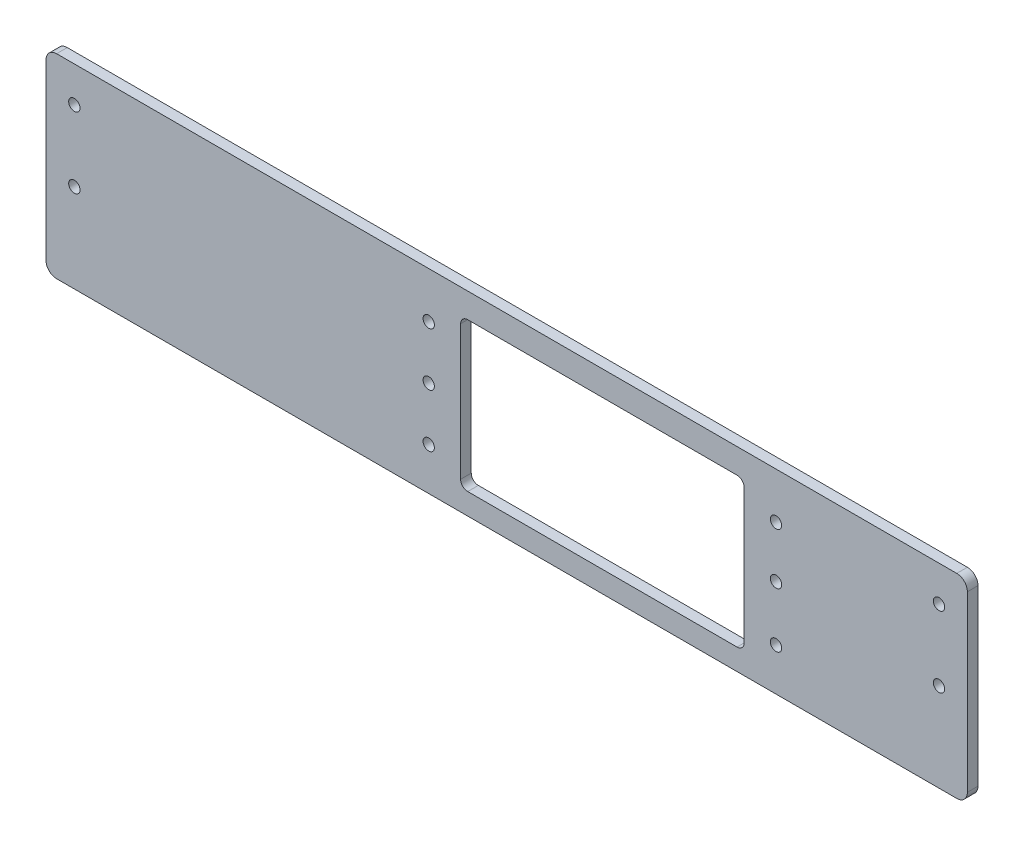
ISO-10303-21;
HEADER;
FILE_DESCRIPTION(('STEP AP214'),'2;1');
FILE_NAME('part.step','',(''),(''),'','','');
FILE_SCHEMA(('AUTOMOTIVE_DESIGN { 1 0 10303 214 1 1 1 1 }'));
ENDSEC;
DATA;
#1=APPLICATION_CONTEXT('core data for automotive mechanical design processes');
#2=APPLICATION_PROTOCOL_DEFINITION('international standard','automotive_design',2000,#1);
#3=PRODUCT_CONTEXT('',#1,'mechanical');
#4=PRODUCT('Part','Part','',(#3));
#5=PRODUCT_RELATED_PRODUCT_CATEGORY('part','',(#4));
#6=PRODUCT_DEFINITION_FORMATION('','',#4);
#7=PRODUCT_DEFINITION_CONTEXT('part definition',#1,'design');
#8=PRODUCT_DEFINITION('design','',#6,#7);
#9=PRODUCT_DEFINITION_SHAPE('','',#8);
#10=(LENGTH_UNIT() NAMED_UNIT(*) SI_UNIT(.MILLI.,.METRE.));
#11=(NAMED_UNIT(*) PLANE_ANGLE_UNIT() SI_UNIT($,.RADIAN.));
#12=(NAMED_UNIT(*) SI_UNIT($,.STERADIAN.) SOLID_ANGLE_UNIT());
#13=UNCERTAINTY_MEASURE_WITH_UNIT(LENGTH_MEASURE(1.E-05),#10,'distance_accuracy_value','');
#14=(GEOMETRIC_REPRESENTATION_CONTEXT(3) GLOBAL_UNCERTAINTY_ASSIGNED_CONTEXT((#13)) GLOBAL_UNIT_ASSIGNED_CONTEXT((#10,
#11,#12)) REPRESENTATION_CONTEXT('',''));
#15=CARTESIAN_POINT('',(0.,0.,0.));
#16=DIRECTION('',(0.,0.,1.));
#17=DIRECTION('',(1.,0.,0.));
#18=AXIS2_PLACEMENT_3D('',#15,#16,#17);
#19=CARTESIAN_POINT('',(-130.,-27.5,3.));
#20=DIRECTION('',(1.,0.,0.));
#21=DIRECTION('',(0.,0.,-1.));
#22=AXIS2_PLACEMENT_3D('',#19,#20,#21);
#23=PLANE('',#22);
#24=DIRECTION('',(0.,-1.,0.));
#25=VECTOR('',#24,1.);
#26=CARTESIAN_POINT('',(-130.,-27.5,0.));
#27=LINE('',#26,#25);
#28=CARTESIAN_POINT('',(-130.,24.5,0.));
#29=VERTEX_POINT('',#28);
#30=CARTESIAN_POINT('',(-130.,-24.5,0.));
#31=VERTEX_POINT('',#30);
#32=EDGE_CURVE('E227',#29,#31,#27,.T.);
#33=ORIENTED_EDGE('',*,*,#32,.T.);
#34=DIRECTION('',(0.,0.,-1.));
#35=VECTOR('',#34,1.);
#36=CARTESIAN_POINT('',(-130.,-24.5,3.));
#37=LINE('',#36,#35);
#38=CARTESIAN_POINT('',(-130.,-24.5,3.));
#39=VERTEX_POINT('',#38);
#40=EDGE_CURVE('E211',#31,#39,#37,.F.);
#41=ORIENTED_EDGE('',*,*,#40,.T.);
#42=DIRECTION('',(0.,-1.,0.));
#43=VECTOR('',#42,1.);
#44=CARTESIAN_POINT('',(-130.,-27.5,3.));
#45=LINE('',#44,#43);
#46=CARTESIAN_POINT('',(-130.,24.5,3.));
#47=VERTEX_POINT('',#46);
#48=EDGE_CURVE('E177',#47,#39,#45,.T.);
#49=ORIENTED_EDGE('',*,*,#48,.F.);
#50=DIRECTION('',(0.,0.,-1.));
#51=VECTOR('',#50,1.);
#52=CARTESIAN_POINT('',(-130.,24.5,3.));
#53=LINE('',#52,#51);
#54=EDGE_CURVE('E208',#47,#29,#53,.T.);
#55=ORIENTED_EDGE('',*,*,#54,.T.);
#56=EDGE_LOOP('',(#33,#41,#49,#55));
#57=FACE_BOUND('',#56,.T.);
#58=ADVANCED_FACE('F38',(#57),#23,.F.);
#59=CARTESIAN_POINT('',(130.,-27.5,3.));
#60=DIRECTION('',(0.,1.,0.));
#61=DIRECTION('',(-1.,0.,0.));
#62=AXIS2_PLACEMENT_3D('',#59,#60,#61);
#63=PLANE('',#62);
#64=DIRECTION('',(1.,0.,0.));
#65=VECTOR('',#64,1.);
#66=CARTESIAN_POINT('',(130.,-27.5,0.));
#67=LINE('',#66,#65);
#68=CARTESIAN_POINT('',(-127.,-27.5,0.));
#69=VERTEX_POINT('',#68);
#70=CARTESIAN_POINT('',(127.,-27.5,0.));
#71=VERTEX_POINT('',#70);
#72=EDGE_CURVE('E183',#69,#71,#67,.T.);
#73=ORIENTED_EDGE('',*,*,#72,.T.);
#74=DIRECTION('',(0.,0.,-1.));
#75=VECTOR('',#74,1.);
#76=CARTESIAN_POINT('',(127.,-27.5,3.));
#77=LINE('',#76,#75);
#78=CARTESIAN_POINT('',(127.,-27.5,3.));
#79=VERTEX_POINT('',#78);
#80=EDGE_CURVE('E206',#71,#79,#77,.F.);
#81=ORIENTED_EDGE('',*,*,#80,.T.);
#82=DIRECTION('',(1.,0.,0.));
#83=VECTOR('',#82,1.);
#84=CARTESIAN_POINT('',(130.,-27.5,3.));
#85=LINE('',#84,#83);
#86=CARTESIAN_POINT('',(-127.,-27.5,3.));
#87=VERTEX_POINT('',#86);
#88=EDGE_CURVE('E181',#87,#79,#85,.T.);
#89=ORIENTED_EDGE('',*,*,#88,.F.);
#90=DIRECTION('',(0.,0.,-1.));
#91=VECTOR('',#90,1.);
#92=CARTESIAN_POINT('',(-127.,-27.5,3.));
#93=LINE('',#92,#91);
#94=EDGE_CURVE('E203',#87,#69,#93,.T.);
#95=ORIENTED_EDGE('',*,*,#94,.T.);
#96=EDGE_LOOP('',(#73,#81,#89,#95));
#97=FACE_BOUND('',#96,.T.);
#98=ADVANCED_FACE('F345',(#97),#63,.F.);
#99=CARTESIAN_POINT('',(130.,-27.5,3.));
#100=DIRECTION('',(-1.,0.,0.));
#101=DIRECTION('',(0.,0.,1.));
#102=AXIS2_PLACEMENT_3D('',#99,#100,#101);
#103=PLANE('',#102);
#104=DIRECTION('',(0.,1.,0.));
#105=VECTOR('',#104,1.);
#106=CARTESIAN_POINT('',(130.,-27.5,0.));
#107=LINE('',#106,#105);
#108=CARTESIAN_POINT('',(130.,-24.5,0.));
#109=VERTEX_POINT('',#108);
#110=CARTESIAN_POINT('',(130.,24.5,0.));
#111=VERTEX_POINT('',#110);
#112=EDGE_CURVE('E178',#109,#111,#107,.T.);
#113=ORIENTED_EDGE('',*,*,#112,.T.);
#114=DIRECTION('',(0.,0.,-1.));
#115=VECTOR('',#114,1.);
#116=CARTESIAN_POINT('',(130.,24.5,3.));
#117=LINE('',#116,#115);
#118=CARTESIAN_POINT('',(130.,24.5,3.));
#119=VERTEX_POINT('',#118);
#120=EDGE_CURVE('E156',#111,#119,#117,.F.);
#121=ORIENTED_EDGE('',*,*,#120,.T.);
#122=DIRECTION('',(0.,1.,0.));
#123=VECTOR('',#122,1.);
#124=CARTESIAN_POINT('',(130.,-27.5,3.));
#125=LINE('',#124,#123);
#126=CARTESIAN_POINT('',(130.,-24.5,3.));
#127=VERTEX_POINT('',#126);
#128=EDGE_CURVE('E336',#127,#119,#125,.T.);
#129=ORIENTED_EDGE('',*,*,#128,.F.);
#130=DIRECTION('',(0.,0.,-1.));
#131=VECTOR('',#130,1.);
#132=CARTESIAN_POINT('',(130.,-24.5,3.));
#133=LINE('',#132,#131);
#134=EDGE_CURVE('E161',#127,#109,#133,.T.);
#135=ORIENTED_EDGE('',*,*,#134,.T.);
#136=EDGE_LOOP('',(#113,#121,#129,#135));
#137=FACE_BOUND('',#136,.T.);
#138=ADVANCED_FACE('F355',(#137),#103,.F.);
#139=CARTESIAN_POINT('',(130.,27.5,3.));
#140=DIRECTION('',(0.,-1.,0.));
#141=DIRECTION('',(1.,0.,0.));
#142=AXIS2_PLACEMENT_3D('',#139,#140,#141);
#143=PLANE('',#142);
#144=DIRECTION('',(-1.,0.,0.));
#145=VECTOR('',#144,1.);
#146=CARTESIAN_POINT('',(130.,27.5,3.));
#147=LINE('',#146,#145);
#148=CARTESIAN_POINT('',(127.,27.5,3.));
#149=VERTEX_POINT('',#148);
#150=CARTESIAN_POINT('',(-127.,27.5,3.));
#151=VERTEX_POINT('',#150);
#152=EDGE_CURVE('E171',#149,#151,#147,.T.);
#153=ORIENTED_EDGE('',*,*,#152,.F.);
#154=DIRECTION('',(0.,0.,-1.));
#155=VECTOR('',#154,1.);
#156=CARTESIAN_POINT('',(127.,27.5,3.));
#157=LINE('',#156,#155);
#158=CARTESIAN_POINT('',(127.,27.5,0.));
#159=VERTEX_POINT('',#158);
#160=EDGE_CURVE('E155',#149,#159,#157,.T.);
#161=ORIENTED_EDGE('',*,*,#160,.T.);
#162=DIRECTION('',(-1.,0.,0.));
#163=VECTOR('',#162,1.);
#164=CARTESIAN_POINT('',(130.,27.5,0.));
#165=LINE('',#164,#163);
#166=CARTESIAN_POINT('',(-127.,27.5,0.));
#167=VERTEX_POINT('',#166);
#168=EDGE_CURVE('E168',#159,#167,#165,.T.);
#169=ORIENTED_EDGE('',*,*,#168,.T.);
#170=DIRECTION('',(0.,0.,-1.));
#171=VECTOR('',#170,1.);
#172=CARTESIAN_POINT('',(-127.,27.5,3.));
#173=LINE('',#172,#171);
#174=EDGE_CURVE('E173',#167,#151,#173,.F.);
#175=ORIENTED_EDGE('',*,*,#174,.T.);
#176=EDGE_LOOP('',(#153,#161,#169,#175));
#177=FACE_BOUND('',#176,.T.);
#178=ADVANCED_FACE('F167',(#177),#143,.F.);
#179=CARTESIAN_POINT('',(0.,0.,3.));
#180=DIRECTION('',(0.,0.,1.));
#181=DIRECTION('',(1.,0.,0.));
#182=AXIS2_PLACEMENT_3D('',#179,#180,#181);
#183=PLANE('',#182);
#184=CARTESIAN_POINT('',(75.9999999999999,14.5,3.));
#185=DIRECTION('',(0.,0.,1.));
#186=DIRECTION('',(1.,0.,0.));
#187=AXIS2_PLACEMENT_3D('',#184,#185,#186);
#188=CIRCLE('',#187,1.6);
#189=CARTESIAN_POINT('',(77.5999999999999,14.5,3.));
#190=VERTEX_POINT('',#189);
#191=EDGE_CURVE('E639',#190,#190,#188,.T.);
#192=ORIENTED_EDGE('',*,*,#191,.F.);
#193=EDGE_LOOP('',(#192));
#194=FACE_BOUND('',#193,.T.);
#195=CARTESIAN_POINT('',(-22.0000000000001,-15.5,3.));
#196=DIRECTION('',(0.,0.,1.));
#197=DIRECTION('',(1.,0.,0.));
#198=AXIS2_PLACEMENT_3D('',#195,#196,#197);
#199=CIRCLE('',#198,1.6);
#200=CARTESIAN_POINT('',(-20.4000000000001,-15.5,3.));
#201=VERTEX_POINT('',#200);
#202=EDGE_CURVE('E642',#201,#201,#199,.T.);
#203=ORIENTED_EDGE('',*,*,#202,.F.);
#204=EDGE_LOOP('',(#203));
#205=FACE_BOUND('',#204,.T.);
#206=CARTESIAN_POINT('',(-22.0000000000001,-0.499999999999995,3.));
#207=DIRECTION('',(0.,0.,1.));
#208=DIRECTION('',(1.,0.,0.));
#209=AXIS2_PLACEMENT_3D('',#206,#207,#208);
#210=CIRCLE('',#209,1.6);
#211=CARTESIAN_POINT('',(-20.4000000000001,-0.499999999999995,3.));
#212=VERTEX_POINT('',#211);
#213=EDGE_CURVE('E645',#212,#212,#210,.T.);
#214=ORIENTED_EDGE('',*,*,#213,.F.);
#215=EDGE_LOOP('',(#214));
#216=FACE_BOUND('',#215,.T.);
#217=CARTESIAN_POINT('',(-22.0000000000001,14.5,3.));
#218=DIRECTION('',(0.,0.,1.));
#219=DIRECTION('',(1.,0.,0.));
#220=AXIS2_PLACEMENT_3D('',#217,#218,#219);
#221=CIRCLE('',#220,1.6);
#222=CARTESIAN_POINT('',(-20.4000000000001,14.5,3.));
#223=VERTEX_POINT('',#222);
#224=EDGE_CURVE('E320',#223,#223,#221,.T.);
#225=ORIENTED_EDGE('',*,*,#224,.F.);
#226=EDGE_LOOP('',(#225));
#227=FACE_BOUND('',#226,.T.);
#228=CARTESIAN_POINT('',(75.9999999999999,0.,3.));
#229=DIRECTION('',(0.,0.,1.));
#230=DIRECTION('',(1.,0.,0.));
#231=AXIS2_PLACEMENT_3D('',#228,#229,#230);
#232=CIRCLE('',#231,1.60000000000001);
#233=CARTESIAN_POINT('',(77.5999999999999,0.,3.));
#234=VERTEX_POINT('',#233);
#235=EDGE_CURVE('E636',#234,#234,#232,.T.);
#236=ORIENTED_EDGE('',*,*,#235,.F.);
#237=EDGE_LOOP('',(#236));
#238=FACE_BOUND('',#237,.T.);
#239=CARTESIAN_POINT('',(75.9999999999999,-15.5,3.));
#240=DIRECTION('',(0.,0.,1.));
#241=DIRECTION('',(1.,0.,0.));
#242=AXIS2_PLACEMENT_3D('',#239,#240,#241);
#243=CIRCLE('',#242,1.6);
#244=CARTESIAN_POINT('',(77.5999999999999,-15.5,3.));
#245=VERTEX_POINT('',#244);
#246=EDGE_CURVE('E632',#245,#245,#243,.T.);
#247=ORIENTED_EDGE('',*,*,#246,.F.);
#248=EDGE_LOOP('',(#247));
#249=FACE_BOUND('',#248,.T.);
#250=DIRECTION('',(0.,-1.,0.));
#251=VECTOR('',#250,1.);
#252=CARTESIAN_POINT('',(-13.0000000000001,20.5,3.));
#253=LINE('',#252,#251);
#254=CARTESIAN_POINT('',(-13.0000000000001,18.5,3.));
#255=VERTEX_POINT('',#254);
#256=CARTESIAN_POINT('',(-13.0000000000001,-19.5,3.));
#257=VERTEX_POINT('',#256);
#258=EDGE_CURVE('E293',#255,#257,#253,.T.);
#259=ORIENTED_EDGE('',*,*,#258,.F.);
#260=CARTESIAN_POINT('',(-11.0000000000001,18.5,3.));
#261=DIRECTION('',(0.,0.,1.));
#262=DIRECTION('',(1.,0.,0.));
#263=AXIS2_PLACEMENT_3D('',#260,#261,#262);
#264=CIRCLE('',#263,2.);
#265=CARTESIAN_POINT('',(-11.0000000000001,20.5,3.));
#266=VERTEX_POINT('',#265);
#267=EDGE_CURVE('E46',#255,#266,#264,.F.);
#268=ORIENTED_EDGE('',*,*,#267,.T.);
#269=DIRECTION('',(-1.,0.,0.));
#270=VECTOR('',#269,1.);
#271=CARTESIAN_POINT('',(-13.0000000000001,20.5,3.));
#272=LINE('',#271,#270);
#273=CARTESIAN_POINT('',(64.9999999999999,20.5,3.));
#274=VERTEX_POINT('',#273);
#275=EDGE_CURVE('E242',#274,#266,#272,.T.);
#276=ORIENTED_EDGE('',*,*,#275,.F.);
#277=CARTESIAN_POINT('',(64.9999999999999,18.5,3.));
#278=DIRECTION('',(0.,0.,1.));
#279=DIRECTION('',(1.,0.,0.));
#280=AXIS2_PLACEMENT_3D('',#277,#278,#279);
#281=CIRCLE('',#280,2.);
#282=CARTESIAN_POINT('',(66.9999999999999,18.5,3.));
#283=VERTEX_POINT('',#282);
#284=EDGE_CURVE('E276',#274,#283,#281,.F.);
#285=ORIENTED_EDGE('',*,*,#284,.T.);
#286=DIRECTION('',(0.,1.,0.));
#287=VECTOR('',#286,1.);
#288=CARTESIAN_POINT('',(66.9999999999999,20.5,3.));
#289=LINE('',#288,#287);
#290=CARTESIAN_POINT('',(66.9999999999999,-19.5,3.));
#291=VERTEX_POINT('',#290);
#292=EDGE_CURVE('E301',#291,#283,#289,.T.);
#293=ORIENTED_EDGE('',*,*,#292,.F.);
#294=CARTESIAN_POINT('',(64.9999999999999,-19.5,3.));
#295=DIRECTION('',(0.,0.,1.));
#296=DIRECTION('',(1.,0.,0.));
#297=AXIS2_PLACEMENT_3D('',#294,#295,#296);
#298=CIRCLE('',#297,2.);
#299=CARTESIAN_POINT('',(64.9999999999999,-21.5,3.));
#300=VERTEX_POINT('',#299);
#301=EDGE_CURVE('E280',#291,#300,#298,.F.);
#302=ORIENTED_EDGE('',*,*,#301,.T.);
#303=DIRECTION('',(1.,0.,0.));
#304=VECTOR('',#303,1.);
#305=CARTESIAN_POINT('',(-13.0000000000001,-21.5,3.));
#306=LINE('',#305,#304);
#307=CARTESIAN_POINT('',(-11.0000000000001,-21.5,3.));
#308=VERTEX_POINT('',#307);
#309=EDGE_CURVE('E314',#308,#300,#306,.T.);
#310=ORIENTED_EDGE('',*,*,#309,.F.);
#311=CARTESIAN_POINT('',(-11.0000000000001,-19.5,3.));
#312=DIRECTION('',(0.,0.,1.));
#313=DIRECTION('',(1.,0.,0.));
#314=AXIS2_PLACEMENT_3D('',#311,#312,#313);
#315=CIRCLE('',#314,2.);
#316=EDGE_CURVE('E284',#308,#257,#315,.F.);
#317=ORIENTED_EDGE('',*,*,#316,.T.);
#318=EDGE_LOOP('',(#259,#268,#276,#285,#293,#302,#310,#317));
#319=FACE_BOUND('',#318,.T.);
#320=CARTESIAN_POINT('',(122.,17.5,3.));
#321=DIRECTION('',(0.,0.,1.));
#322=DIRECTION('',(-1.,0.,0.));
#323=AXIS2_PLACEMENT_3D('',#320,#321,#322);
#324=CIRCLE('',#323,1.6);
#325=CARTESIAN_POINT('',(120.4,17.5,3.));
#326=VERTEX_POINT('',#325);
#327=EDGE_CURVE('E257',#326,#326,#324,.T.);
#328=ORIENTED_EDGE('',*,*,#327,.F.);
#329=EDGE_LOOP('',(#328));
#330=FACE_BOUND('',#329,.T.);
#331=CARTESIAN_POINT('',(122.,-2.49999999999999,3.));
#332=DIRECTION('',(0.,0.,1.));
#333=DIRECTION('',(-1.,0.,0.));
#334=AXIS2_PLACEMENT_3D('',#331,#332,#333);
#335=CIRCLE('',#334,1.60000000000001);
#336=CARTESIAN_POINT('',(120.4,-2.49999999999999,3.));
#337=VERTEX_POINT('',#336);
#338=EDGE_CURVE('E327',#337,#337,#335,.T.);
#339=ORIENTED_EDGE('',*,*,#338,.F.);
#340=EDGE_LOOP('',(#339));
#341=FACE_BOUND('',#340,.T.);
#342=CARTESIAN_POINT('',(-122.,-2.49999999999999,3.));
#343=DIRECTION('',(0.,0.,1.));
#344=DIRECTION('',(1.,0.,0.));
#345=AXIS2_PLACEMENT_3D('',#342,#343,#344);
#346=CIRCLE('',#345,1.60000000000001);
#347=CARTESIAN_POINT('',(-120.4,-2.49999999999999,3.));
#348=VERTEX_POINT('',#347);
#349=EDGE_CURVE('E324',#348,#348,#346,.T.);
#350=ORIENTED_EDGE('',*,*,#349,.F.);
#351=EDGE_LOOP('',(#350));
#352=FACE_BOUND('',#351,.T.);
#353=CARTESIAN_POINT('',(-122.,17.5,3.));
#354=DIRECTION('',(0.,0.,1.));
#355=DIRECTION('',(1.,0.,0.));
#356=AXIS2_PLACEMENT_3D('',#353,#354,#355);
#357=CIRCLE('',#356,1.6);
#358=CARTESIAN_POINT('',(-120.4,17.5,3.));
#359=VERTEX_POINT('',#358);
#360=EDGE_CURVE('E218',#359,#359,#357,.T.);
#361=ORIENTED_EDGE('',*,*,#360,.F.);
#362=EDGE_LOOP('',(#361));
#363=FACE_BOUND('',#362,.T.);
#364=ORIENTED_EDGE('',*,*,#128,.T.);
#365=CARTESIAN_POINT('',(127.,24.5,3.));
#366=DIRECTION('',(0.,0.,1.));
#367=DIRECTION('',(1.,0.,0.));
#368=AXIS2_PLACEMENT_3D('',#365,#366,#367);
#369=CIRCLE('',#368,3.);
#370=EDGE_CURVE('E201',#119,#149,#369,.T.);
#371=ORIENTED_EDGE('',*,*,#370,.T.);
#372=ORIENTED_EDGE('',*,*,#152,.T.);
#373=CARTESIAN_POINT('',(-127.,24.5,3.));
#374=DIRECTION('',(0.,0.,1.));
#375=DIRECTION('',(1.,0.,0.));
#376=AXIS2_PLACEMENT_3D('',#373,#374,#375);
#377=CIRCLE('',#376,3.);
#378=EDGE_CURVE('E195',#151,#47,#377,.T.);
#379=ORIENTED_EDGE('',*,*,#378,.T.);
#380=ORIENTED_EDGE('',*,*,#48,.T.);
#381=CARTESIAN_POINT('',(-127.,-24.5,3.));
#382=DIRECTION('',(0.,0.,1.));
#383=DIRECTION('',(1.,0.,0.));
#384=AXIS2_PLACEMENT_3D('',#381,#382,#383);
#385=CIRCLE('',#384,3.);
#386=EDGE_CURVE('E197',#39,#87,#385,.T.);
#387=ORIENTED_EDGE('',*,*,#386,.T.);
#388=ORIENTED_EDGE('',*,*,#88,.T.);
#389=CARTESIAN_POINT('',(127.,-24.5,3.));
#390=DIRECTION('',(0.,0.,1.));
#391=DIRECTION('',(1.,0.,0.));
#392=AXIS2_PLACEMENT_3D('',#389,#390,#391);
#393=CIRCLE('',#392,3.);
#394=EDGE_CURVE('E199',#79,#127,#393,.T.);
#395=ORIENTED_EDGE('',*,*,#394,.T.);
#396=EDGE_LOOP('',(#364,#371,#372,#379,#380,#387,#388,#395));
#397=FACE_BOUND('',#396,.T.);
#398=ADVANCED_FACE('F291',(#194,#205,#216,#227,#238,#249,#319,#330,#341,#352,#363,#397),#183,.T.);
#399=CARTESIAN_POINT('',(0.,0.,0.));
#400=DIRECTION('',(0.,0.,1.));
#401=DIRECTION('',(1.,0.,0.));
#402=AXIS2_PLACEMENT_3D('',#399,#400,#401);
#403=PLANE('',#402);
#404=CARTESIAN_POINT('',(75.9999999999999,14.5,0.));
#405=DIRECTION('',(0.,0.,1.));
#406=DIRECTION('',(1.,0.,0.));
#407=AXIS2_PLACEMENT_3D('',#404,#405,#406);
#408=CIRCLE('',#407,1.6);
#409=CARTESIAN_POINT('',(77.5999999999999,14.5,0.));
#410=VERTEX_POINT('',#409);
#411=EDGE_CURVE('E254',#410,#410,#408,.T.);
#412=ORIENTED_EDGE('',*,*,#411,.T.);
#413=EDGE_LOOP('',(#412));
#414=FACE_BOUND('',#413,.T.);
#415=CARTESIAN_POINT('',(-22.0000000000001,-15.5,0.));
#416=DIRECTION('',(0.,0.,1.));
#417=DIRECTION('',(1.,0.,0.));
#418=AXIS2_PLACEMENT_3D('',#415,#416,#417);
#419=CIRCLE('',#418,1.6);
#420=CARTESIAN_POINT('',(-20.4000000000001,-15.5,0.));
#421=VERTEX_POINT('',#420);
#422=EDGE_CURVE('E251',#421,#421,#419,.T.);
#423=ORIENTED_EDGE('',*,*,#422,.T.);
#424=EDGE_LOOP('',(#423));
#425=FACE_BOUND('',#424,.T.);
#426=CARTESIAN_POINT('',(-22.0000000000001,-0.499999999999995,0.));
#427=DIRECTION('',(0.,0.,1.));
#428=DIRECTION('',(1.,0.,0.));
#429=AXIS2_PLACEMENT_3D('',#426,#427,#428);
#430=CIRCLE('',#429,1.6);
#431=CARTESIAN_POINT('',(-20.4000000000001,-0.499999999999995,0.));
#432=VERTEX_POINT('',#431);
#433=EDGE_CURVE('E248',#432,#432,#430,.T.);
#434=ORIENTED_EDGE('',*,*,#433,.T.);
#435=EDGE_LOOP('',(#434));
#436=FACE_BOUND('',#435,.T.);
#437=CARTESIAN_POINT('',(-22.0000000000001,14.5,0.));
#438=DIRECTION('',(0.,0.,1.));
#439=DIRECTION('',(1.,0.,0.));
#440=AXIS2_PLACEMENT_3D('',#437,#438,#439);
#441=CIRCLE('',#440,1.6);
#442=CARTESIAN_POINT('',(-20.4000000000001,14.5,0.));
#443=VERTEX_POINT('',#442);
#444=EDGE_CURVE('E245',#443,#443,#441,.T.);
#445=ORIENTED_EDGE('',*,*,#444,.T.);
#446=EDGE_LOOP('',(#445));
#447=FACE_BOUND('',#446,.T.);
#448=CARTESIAN_POINT('',(75.9999999999999,0.,0.));
#449=DIRECTION('',(0.,0.,1.));
#450=DIRECTION('',(1.,0.,0.));
#451=AXIS2_PLACEMENT_3D('',#448,#449,#450);
#452=CIRCLE('',#451,1.60000000000001);
#453=CARTESIAN_POINT('',(77.5999999999999,0.,0.));
#454=VERTEX_POINT('',#453);
#455=EDGE_CURVE('E241',#454,#454,#452,.T.);
#456=ORIENTED_EDGE('',*,*,#455,.T.);
#457=EDGE_LOOP('',(#456));
#458=FACE_BOUND('',#457,.T.);
#459=CARTESIAN_POINT('',(75.9999999999999,-15.5,0.));
#460=DIRECTION('',(0.,0.,1.));
#461=DIRECTION('',(1.,0.,0.));
#462=AXIS2_PLACEMENT_3D('',#459,#460,#461);
#463=CIRCLE('',#462,1.6);
#464=CARTESIAN_POINT('',(77.5999999999999,-15.5,0.));
#465=VERTEX_POINT('',#464);
#466=EDGE_CURVE('E238',#465,#465,#463,.T.);
#467=ORIENTED_EDGE('',*,*,#466,.T.);
#468=EDGE_LOOP('',(#467));
#469=FACE_BOUND('',#468,.T.);
#470=DIRECTION('',(0.,1.,0.));
#471=VECTOR('',#470,1.);
#472=CARTESIAN_POINT('',(66.9999999999999,0.,0.));
#473=LINE('',#472,#471);
#474=CARTESIAN_POINT('',(66.9999999999999,-19.5,0.));
#475=VERTEX_POINT('',#474);
#476=CARTESIAN_POINT('',(66.9999999999999,18.5,0.));
#477=VERTEX_POINT('',#476);
#478=EDGE_CURVE('E230',#475,#477,#473,.T.);
#479=ORIENTED_EDGE('',*,*,#478,.T.);
#480=CARTESIAN_POINT('',(64.9999999999999,18.5,0.));
#481=DIRECTION('',(0.,0.,1.));
#482=DIRECTION('',(1.,0.,0.));
#483=AXIS2_PLACEMENT_3D('',#480,#481,#482);
#484=CIRCLE('',#483,2.);
#485=CARTESIAN_POINT('',(64.9999999999999,20.5,0.));
#486=VERTEX_POINT('',#485);
#487=EDGE_CURVE('E278',#477,#486,#484,.T.);
#488=ORIENTED_EDGE('',*,*,#487,.T.);
#489=DIRECTION('',(-1.,0.,0.));
#490=VECTOR('',#489,1.);
#491=CARTESIAN_POINT('',(0.,20.5,0.));
#492=LINE('',#491,#490);
#493=CARTESIAN_POINT('',(-11.0000000000001,20.5,0.));
#494=VERTEX_POINT('',#493);
#495=EDGE_CURVE('E233',#486,#494,#492,.T.);
#496=ORIENTED_EDGE('',*,*,#495,.T.);
#497=CARTESIAN_POINT('',(-11.0000000000001,18.5,0.));
#498=DIRECTION('',(0.,0.,1.));
#499=DIRECTION('',(1.,0.,0.));
#500=AXIS2_PLACEMENT_3D('',#497,#498,#499);
#501=CIRCLE('',#500,2.);
#502=CARTESIAN_POINT('',(-13.0000000000001,18.5,0.));
#503=VERTEX_POINT('',#502);
#504=EDGE_CURVE('E11',#494,#503,#501,.T.);
#505=ORIENTED_EDGE('',*,*,#504,.T.);
#506=DIRECTION('',(0.,-1.,0.));
#507=VECTOR('',#506,1.);
#508=CARTESIAN_POINT('',(-13.0000000000001,0.,0.));
#509=LINE('',#508,#507);
#510=CARTESIAN_POINT('',(-13.0000000000001,-19.5,0.));
#511=VERTEX_POINT('',#510);
#512=EDGE_CURVE('E235',#503,#511,#509,.T.);
#513=ORIENTED_EDGE('',*,*,#512,.T.);
#514=CARTESIAN_POINT('',(-11.0000000000001,-19.5,0.));
#515=DIRECTION('',(0.,0.,1.));
#516=DIRECTION('',(1.,0.,0.));
#517=AXIS2_PLACEMENT_3D('',#514,#515,#516);
#518=CIRCLE('',#517,2.);
#519=CARTESIAN_POINT('',(-11.0000000000001,-21.5,0.));
#520=VERTEX_POINT('',#519);
#521=EDGE_CURVE('E286',#511,#520,#518,.T.);
#522=ORIENTED_EDGE('',*,*,#521,.T.);
#523=DIRECTION('',(1.,0.,0.));
#524=VECTOR('',#523,1.);
#525=CARTESIAN_POINT('',(0.,-21.5,0.));
#526=LINE('',#525,#524);
#527=CARTESIAN_POINT('',(64.9999999999999,-21.5,0.));
#528=VERTEX_POINT('',#527);
#529=EDGE_CURVE('E213',#520,#528,#526,.T.);
#530=ORIENTED_EDGE('',*,*,#529,.T.);
#531=CARTESIAN_POINT('',(64.9999999999999,-19.5,0.));
#532=DIRECTION('',(0.,0.,1.));
#533=DIRECTION('',(1.,0.,0.));
#534=AXIS2_PLACEMENT_3D('',#531,#532,#533);
#535=CIRCLE('',#534,2.);
#536=EDGE_CURVE('E282',#528,#475,#535,.T.);
#537=ORIENTED_EDGE('',*,*,#536,.T.);
#538=EDGE_LOOP('',(#479,#488,#496,#505,#513,#522,#530,#537));
#539=FACE_BOUND('',#538,.T.);
#540=CARTESIAN_POINT('',(122.,17.5,0.));
#541=DIRECTION('',(0.,0.,1.));
#542=DIRECTION('',(1.,0.,0.));
#543=AXIS2_PLACEMENT_3D('',#540,#541,#542);
#544=CIRCLE('',#543,1.6);
#545=CARTESIAN_POINT('',(123.6,17.5,0.));
#546=VERTEX_POINT('',#545);
#547=EDGE_CURVE('E224',#546,#546,#544,.T.);
#548=ORIENTED_EDGE('',*,*,#547,.T.);
#549=EDGE_LOOP('',(#548));
#550=FACE_BOUND('',#549,.T.);
#551=CARTESIAN_POINT('',(122.,-2.49999999999999,0.));
#552=DIRECTION('',(0.,0.,1.));
#553=DIRECTION('',(1.,0.,0.));
#554=AXIS2_PLACEMENT_3D('',#551,#552,#553);
#555=CIRCLE('',#554,1.60000000000001);
#556=CARTESIAN_POINT('',(123.6,-2.49999999999999,0.));
#557=VERTEX_POINT('',#556);
#558=EDGE_CURVE('E221',#557,#557,#555,.T.);
#559=ORIENTED_EDGE('',*,*,#558,.T.);
#560=EDGE_LOOP('',(#559));
#561=FACE_BOUND('',#560,.T.);
#562=CARTESIAN_POINT('',(-122.,-2.49999999999999,0.));
#563=DIRECTION('',(0.,0.,1.));
#564=DIRECTION('',(1.,0.,0.));
#565=AXIS2_PLACEMENT_3D('',#562,#563,#564);
#566=CIRCLE('',#565,1.60000000000001);
#567=CARTESIAN_POINT('',(-120.4,-2.49999999999999,0.));
#568=VERTEX_POINT('',#567);
#569=EDGE_CURVE('E217',#568,#568,#566,.T.);
#570=ORIENTED_EDGE('',*,*,#569,.T.);
#571=EDGE_LOOP('',(#570));
#572=FACE_BOUND('',#571,.T.);
#573=CARTESIAN_POINT('',(-122.,17.5,0.));
#574=DIRECTION('',(0.,0.,1.));
#575=DIRECTION('',(1.,0.,0.));
#576=AXIS2_PLACEMENT_3D('',#573,#574,#575);
#577=CIRCLE('',#576,1.6);
#578=CARTESIAN_POINT('',(-120.4,17.5,0.));
#579=VERTEX_POINT('',#578);
#580=EDGE_CURVE('E214',#579,#579,#577,.T.);
#581=ORIENTED_EDGE('',*,*,#580,.T.);
#582=EDGE_LOOP('',(#581));
#583=FACE_BOUND('',#582,.T.);
#584=ORIENTED_EDGE('',*,*,#168,.F.);
#585=CARTESIAN_POINT('',(127.,24.5,0.));
#586=DIRECTION('',(0.,0.,1.));
#587=DIRECTION('',(1.,0.,0.));
#588=AXIS2_PLACEMENT_3D('',#585,#586,#587);
#589=CIRCLE('',#588,3.);
#590=EDGE_CURVE('E151',#159,#111,#589,.F.);
#591=ORIENTED_EDGE('',*,*,#590,.T.);
#592=ORIENTED_EDGE('',*,*,#112,.F.);
#593=CARTESIAN_POINT('',(127.,-24.5,0.));
#594=DIRECTION('',(0.,0.,1.));
#595=DIRECTION('',(1.,0.,0.));
#596=AXIS2_PLACEMENT_3D('',#593,#594,#595);
#597=CIRCLE('',#596,3.);
#598=EDGE_CURVE('E162',#109,#71,#597,.F.);
#599=ORIENTED_EDGE('',*,*,#598,.T.);
#600=ORIENTED_EDGE('',*,*,#72,.F.);
#601=CARTESIAN_POINT('',(-127.,-24.5,0.));
#602=DIRECTION('',(0.,0.,1.));
#603=DIRECTION('',(1.,0.,0.));
#604=AXIS2_PLACEMENT_3D('',#601,#602,#603);
#605=CIRCLE('',#604,3.);
#606=EDGE_CURVE('E189',#69,#31,#605,.F.);
#607=ORIENTED_EDGE('',*,*,#606,.T.);
#608=ORIENTED_EDGE('',*,*,#32,.F.);
#609=CARTESIAN_POINT('',(-127.,24.5,0.));
#610=DIRECTION('',(0.,0.,1.));
#611=DIRECTION('',(1.,0.,0.));
#612=AXIS2_PLACEMENT_3D('',#609,#610,#611);
#613=CIRCLE('',#612,3.);
#614=EDGE_CURVE('E172',#29,#167,#613,.F.);
#615=ORIENTED_EDGE('',*,*,#614,.T.);
#616=EDGE_LOOP('',(#584,#591,#592,#599,#600,#607,#608,#615));
#617=FACE_BOUND('',#616,.T.);
#618=ADVANCED_FACE('F175',(#414,#425,#436,#447,#458,#469,#539,#550,#561,#572,#583,#617),#403,.F.);
#619=CARTESIAN_POINT('',(127.,24.5,3.));
#620=DIRECTION('',(0.,0.,-1.));
#621=DIRECTION('',(-1.,0.,0.));
#622=AXIS2_PLACEMENT_3D('',#619,#620,#621);
#623=CYLINDRICAL_SURFACE('',#622,3.);
#624=ORIENTED_EDGE('',*,*,#370,.F.);
#625=ORIENTED_EDGE('',*,*,#120,.F.);
#626=ORIENTED_EDGE('',*,*,#590,.F.);
#627=ORIENTED_EDGE('',*,*,#160,.F.);
#628=EDGE_LOOP('',(#624,#625,#626,#627));
#629=FACE_BOUND('',#628,.T.);
#630=ADVANCED_FACE('F154',(#629),#623,.T.);
#631=CARTESIAN_POINT('',(127.,-24.5,3.));
#632=DIRECTION('',(0.,0.,-1.));
#633=DIRECTION('',(-1.,0.,0.));
#634=AXIS2_PLACEMENT_3D('',#631,#632,#633);
#635=CYLINDRICAL_SURFACE('',#634,3.);
#636=ORIENTED_EDGE('',*,*,#394,.F.);
#637=ORIENTED_EDGE('',*,*,#80,.F.);
#638=ORIENTED_EDGE('',*,*,#598,.F.);
#639=ORIENTED_EDGE('',*,*,#134,.F.);
#640=EDGE_LOOP('',(#636,#637,#638,#639));
#641=FACE_BOUND('',#640,.T.);
#642=ADVANCED_FACE('F350',(#641),#635,.T.);
#643=CARTESIAN_POINT('',(-127.,-24.5,3.));
#644=DIRECTION('',(0.,0.,-1.));
#645=DIRECTION('',(-1.,0.,0.));
#646=AXIS2_PLACEMENT_3D('',#643,#644,#645);
#647=CYLINDRICAL_SURFACE('',#646,3.);
#648=ORIENTED_EDGE('',*,*,#386,.F.);
#649=ORIENTED_EDGE('',*,*,#40,.F.);
#650=ORIENTED_EDGE('',*,*,#606,.F.);
#651=ORIENTED_EDGE('',*,*,#94,.F.);
#652=EDGE_LOOP('',(#648,#649,#650,#651));
#653=FACE_BOUND('',#652,.T.);
#654=ADVANCED_FACE('F374',(#653),#647,.T.);
#655=CARTESIAN_POINT('',(-127.,24.5,3.));
#656=DIRECTION('',(0.,0.,-1.));
#657=DIRECTION('',(-1.,0.,0.));
#658=AXIS2_PLACEMENT_3D('',#655,#656,#657);
#659=CYLINDRICAL_SURFACE('',#658,3.);
#660=ORIENTED_EDGE('',*,*,#378,.F.);
#661=ORIENTED_EDGE('',*,*,#174,.F.);
#662=ORIENTED_EDGE('',*,*,#614,.F.);
#663=ORIENTED_EDGE('',*,*,#54,.F.);
#664=EDGE_LOOP('',(#660,#661,#662,#663));
#665=FACE_BOUND('',#664,.T.);
#666=ADVANCED_FACE('F377',(#665),#659,.T.);
#667=CARTESIAN_POINT('',(-122.,17.5,-45.));
#668=DIRECTION('',(0.,0.,1.));
#669=DIRECTION('',(1.,0.,0.));
#670=AXIS2_PLACEMENT_3D('',#667,#668,#669);
#671=CYLINDRICAL_SURFACE('',#670,1.6);
#672=ORIENTED_EDGE('',*,*,#360,.T.);
#673=EDGE_LOOP('',(#672));
#674=FACE_BOUND('',#673,.T.);
#675=ORIENTED_EDGE('',*,*,#580,.F.);
#676=EDGE_LOOP('',(#675));
#677=FACE_BOUND('',#676,.T.);
#678=ADVANCED_FACE('F381',(#674,#677),#671,.F.);
#679=CARTESIAN_POINT('',(-122.,-2.49999999999999,-45.));
#680=DIRECTION('',(0.,0.,1.));
#681=DIRECTION('',(1.,0.,0.));
#682=AXIS2_PLACEMENT_3D('',#679,#680,#681);
#683=CYLINDRICAL_SURFACE('',#682,1.60000000000001);
#684=ORIENTED_EDGE('',*,*,#349,.T.);
#685=EDGE_LOOP('',(#684));
#686=FACE_BOUND('',#685,.T.);
#687=ORIENTED_EDGE('',*,*,#569,.F.);
#688=EDGE_LOOP('',(#687));
#689=FACE_BOUND('',#688,.T.);
#690=ADVANCED_FACE('F546',(#686,#689),#683,.F.);
#691=CARTESIAN_POINT('',(122.,-2.49999999999999,-45.));
#692=DIRECTION('',(0.,0.,1.));
#693=DIRECTION('',(1.,0.,0.));
#694=AXIS2_PLACEMENT_3D('',#691,#692,#693);
#695=CYLINDRICAL_SURFACE('',#694,1.60000000000001);
#696=ORIENTED_EDGE('',*,*,#338,.T.);
#697=EDGE_LOOP('',(#696));
#698=FACE_BOUND('',#697,.T.);
#699=ORIENTED_EDGE('',*,*,#558,.F.);
#700=EDGE_LOOP('',(#699));
#701=FACE_BOUND('',#700,.T.);
#702=ADVANCED_FACE('F536',(#698,#701),#695,.F.);
#703=CARTESIAN_POINT('',(122.,17.5,-45.));
#704=DIRECTION('',(0.,0.,1.));
#705=DIRECTION('',(1.,0.,0.));
#706=AXIS2_PLACEMENT_3D('',#703,#704,#705);
#707=CYLINDRICAL_SURFACE('',#706,1.6);
#708=ORIENTED_EDGE('',*,*,#327,.T.);
#709=EDGE_LOOP('',(#708));
#710=FACE_BOUND('',#709,.T.);
#711=ORIENTED_EDGE('',*,*,#547,.F.);
#712=EDGE_LOOP('',(#711));
#713=FACE_BOUND('',#712,.T.);
#714=ADVANCED_FACE('F453',(#710,#713),#707,.F.);
#715=CARTESIAN_POINT('',(-13.0000000000001,20.5,-324.));
#716=DIRECTION('',(-1.,0.,0.));
#717=DIRECTION('',(0.,-1.,0.));
#718=AXIS2_PLACEMENT_3D('',#715,#716,#717);
#719=PLANE('',#718);
#720=ORIENTED_EDGE('',*,*,#258,.T.);
#721=DIRECTION('',(0.,0.,1.));
#722=VECTOR('',#721,1.);
#723=CARTESIAN_POINT('',(-13.0000000000001,-19.5,0.));
#724=LINE('',#723,#722);
#725=EDGE_CURVE('E53',#257,#511,#724,.F.);
#726=ORIENTED_EDGE('',*,*,#725,.T.);
#727=ORIENTED_EDGE('',*,*,#512,.F.);
#728=DIRECTION('',(0.,0.,1.));
#729=VECTOR('',#728,1.);
#730=CARTESIAN_POINT('',(-13.0000000000001,18.5,3.));
#731=LINE('',#730,#729);
#732=EDGE_CURVE('E272',#503,#255,#731,.T.);
#733=ORIENTED_EDGE('',*,*,#732,.T.);
#734=EDGE_LOOP('',(#720,#726,#727,#733));
#735=FACE_BOUND('',#734,.T.);
#736=ADVANCED_FACE('F303',(#735),#719,.F.);
#737=CARTESIAN_POINT('',(-13.0000000000001,20.5,-324.));
#738=DIRECTION('',(0.,1.,0.));
#739=DIRECTION('',(0.,0.,1.));
#740=AXIS2_PLACEMENT_3D('',#737,#738,#739);
#741=PLANE('',#740);
#742=ORIENTED_EDGE('',*,*,#495,.F.);
#743=DIRECTION('',(0.,0.,1.));
#744=VECTOR('',#743,1.);
#745=CARTESIAN_POINT('',(64.9999999999999,20.5,3.));
#746=LINE('',#745,#744);
#747=EDGE_CURVE('E259',#486,#274,#746,.T.);
#748=ORIENTED_EDGE('',*,*,#747,.T.);
#749=ORIENTED_EDGE('',*,*,#275,.T.);
#750=DIRECTION('',(0.,0.,1.));
#751=VECTOR('',#750,1.);
#752=CARTESIAN_POINT('',(-11.0000000000001,20.5,0.));
#753=LINE('',#752,#751);
#754=EDGE_CURVE('E237',#266,#494,#753,.F.);
#755=ORIENTED_EDGE('',*,*,#754,.T.);
#756=EDGE_LOOP('',(#742,#748,#749,#755));
#757=FACE_BOUND('',#756,.T.);
#758=ADVANCED_FACE('F299',(#757),#741,.F.);
#759=CARTESIAN_POINT('',(66.9999999999999,20.5,-324.));
#760=DIRECTION('',(1.,0.,0.));
#761=DIRECTION('',(0.,0.,-1.));
#762=AXIS2_PLACEMENT_3D('',#759,#760,#761);
#763=PLANE('',#762);
#764=ORIENTED_EDGE('',*,*,#292,.T.);
#765=DIRECTION('',(0.,0.,1.));
#766=VECTOR('',#765,1.);
#767=CARTESIAN_POINT('',(66.9999999999999,18.5,0.));
#768=LINE('',#767,#766);
#769=EDGE_CURVE('E265',#283,#477,#768,.F.);
#770=ORIENTED_EDGE('',*,*,#769,.T.);
#771=ORIENTED_EDGE('',*,*,#478,.F.);
#772=DIRECTION('',(0.,0.,1.));
#773=VECTOR('',#772,1.);
#774=CARTESIAN_POINT('',(66.9999999999999,-19.5,3.));
#775=LINE('',#774,#773);
#776=EDGE_CURVE('E262',#475,#291,#775,.T.);
#777=ORIENTED_EDGE('',*,*,#776,.T.);
#778=EDGE_LOOP('',(#764,#770,#771,#777));
#779=FACE_BOUND('',#778,.T.);
#780=ADVANCED_FACE('F425',(#779),#763,.F.);
#781=CARTESIAN_POINT('',(-13.0000000000001,-21.5,-324.));
#782=DIRECTION('',(0.,-1.,0.));
#783=DIRECTION('',(0.,0.,-1.));
#784=AXIS2_PLACEMENT_3D('',#781,#782,#783);
#785=PLANE('',#784);
#786=ORIENTED_EDGE('',*,*,#309,.T.);
#787=DIRECTION('',(0.,0.,1.));
#788=VECTOR('',#787,1.);
#789=CARTESIAN_POINT('',(64.9999999999999,-21.5,0.));
#790=LINE('',#789,#788);
#791=EDGE_CURVE('E270',#300,#528,#790,.F.);
#792=ORIENTED_EDGE('',*,*,#791,.T.);
#793=ORIENTED_EDGE('',*,*,#529,.F.);
#794=DIRECTION('',(0.,0.,1.));
#795=VECTOR('',#794,1.);
#796=CARTESIAN_POINT('',(-11.0000000000001,-21.5,3.));
#797=LINE('',#796,#795);
#798=EDGE_CURVE('E267',#520,#308,#797,.T.);
#799=ORIENTED_EDGE('',*,*,#798,.T.);
#800=EDGE_LOOP('',(#786,#792,#793,#799));
#801=FACE_BOUND('',#800,.T.);
#802=ADVANCED_FACE('F313',(#801),#785,.F.);
#803=CARTESIAN_POINT('',(75.9999999999999,-15.5,-324.));
#804=DIRECTION('',(0.,0.,1.));
#805=DIRECTION('',(1.,0.,0.));
#806=AXIS2_PLACEMENT_3D('',#803,#804,#805);
#807=CYLINDRICAL_SURFACE('',#806,1.6);
#808=ORIENTED_EDGE('',*,*,#246,.T.);
#809=EDGE_LOOP('',(#808));
#810=FACE_BOUND('',#809,.T.);
#811=ORIENTED_EDGE('',*,*,#466,.F.);
#812=EDGE_LOOP('',(#811));
#813=FACE_BOUND('',#812,.T.);
#814=ADVANCED_FACE('F424',(#810,#813),#807,.F.);
#815=CARTESIAN_POINT('',(75.9999999999999,0.,-324.));
#816=DIRECTION('',(0.,0.,1.));
#817=DIRECTION('',(1.,0.,0.));
#818=AXIS2_PLACEMENT_3D('',#815,#816,#817);
#819=CYLINDRICAL_SURFACE('',#818,1.60000000000001);
#820=ORIENTED_EDGE('',*,*,#235,.T.);
#821=EDGE_LOOP('',(#820));
#822=FACE_BOUND('',#821,.T.);
#823=ORIENTED_EDGE('',*,*,#455,.F.);
#824=EDGE_LOOP('',(#823));
#825=FACE_BOUND('',#824,.T.);
#826=ADVANCED_FACE('F512',(#822,#825),#819,.F.);
#827=CARTESIAN_POINT('',(-22.0000000000001,14.5,-324.));
#828=DIRECTION('',(0.,0.,1.));
#829=DIRECTION('',(1.,0.,0.));
#830=AXIS2_PLACEMENT_3D('',#827,#828,#829);
#831=CYLINDRICAL_SURFACE('',#830,1.6);
#832=ORIENTED_EDGE('',*,*,#224,.T.);
#833=EDGE_LOOP('',(#832));
#834=FACE_BOUND('',#833,.T.);
#835=ORIENTED_EDGE('',*,*,#444,.F.);
#836=EDGE_LOOP('',(#835));
#837=FACE_BOUND('',#836,.T.);
#838=ADVANCED_FACE('F502',(#834,#837),#831,.F.);
#839=CARTESIAN_POINT('',(-22.0000000000001,-0.499999999999995,-324.));
#840=DIRECTION('',(0.,0.,1.));
#841=DIRECTION('',(1.,0.,0.));
#842=AXIS2_PLACEMENT_3D('',#839,#840,#841);
#843=CYLINDRICAL_SURFACE('',#842,1.6);
#844=ORIENTED_EDGE('',*,*,#213,.T.);
#845=EDGE_LOOP('',(#844));
#846=FACE_BOUND('',#845,.T.);
#847=ORIENTED_EDGE('',*,*,#433,.F.);
#848=EDGE_LOOP('',(#847));
#849=FACE_BOUND('',#848,.T.);
#850=ADVANCED_FACE('F492',(#846,#849),#843,.F.);
#851=CARTESIAN_POINT('',(-22.0000000000001,-15.5,-324.));
#852=DIRECTION('',(0.,0.,1.));
#853=DIRECTION('',(1.,0.,0.));
#854=AXIS2_PLACEMENT_3D('',#851,#852,#853);
#855=CYLINDRICAL_SURFACE('',#854,1.6);
#856=ORIENTED_EDGE('',*,*,#202,.T.);
#857=EDGE_LOOP('',(#856));
#858=FACE_BOUND('',#857,.T.);
#859=ORIENTED_EDGE('',*,*,#422,.F.);
#860=EDGE_LOOP('',(#859));
#861=FACE_BOUND('',#860,.T.);
#862=ADVANCED_FACE('F482',(#858,#861),#855,.F.);
#863=CARTESIAN_POINT('',(75.9999999999999,14.5,-324.));
#864=DIRECTION('',(0.,0.,1.));
#865=DIRECTION('',(1.,0.,0.));
#866=AXIS2_PLACEMENT_3D('',#863,#864,#865);
#867=CYLINDRICAL_SURFACE('',#866,1.6);
#868=ORIENTED_EDGE('',*,*,#191,.T.);
#869=EDGE_LOOP('',(#868));
#870=FACE_BOUND('',#869,.T.);
#871=ORIENTED_EDGE('',*,*,#411,.F.);
#872=EDGE_LOOP('',(#871));
#873=FACE_BOUND('',#872,.T.);
#874=ADVANCED_FACE('F387',(#870,#873),#867,.F.);
#875=CARTESIAN_POINT('',(64.9999999999999,18.5,-324.));
#876=DIRECTION('',(0.,0.,-1.));
#877=DIRECTION('',(-1.,0.,0.));
#878=AXIS2_PLACEMENT_3D('',#875,#876,#877);
#879=CYLINDRICAL_SURFACE('',#878,2.);
#880=ORIENTED_EDGE('',*,*,#487,.F.);
#881=ORIENTED_EDGE('',*,*,#769,.F.);
#882=ORIENTED_EDGE('',*,*,#284,.F.);
#883=ORIENTED_EDGE('',*,*,#747,.F.);
#884=EDGE_LOOP('',(#880,#881,#882,#883));
#885=FACE_BOUND('',#884,.T.);
#886=ADVANCED_FACE('F383',(#885),#879,.F.);
#887=CARTESIAN_POINT('',(64.9999999999999,-19.5,-324.));
#888=DIRECTION('',(0.,0.,-1.));
#889=DIRECTION('',(-1.,0.,0.));
#890=AXIS2_PLACEMENT_3D('',#887,#888,#889);
#891=CYLINDRICAL_SURFACE('',#890,2.);
#892=ORIENTED_EDGE('',*,*,#536,.F.);
#893=ORIENTED_EDGE('',*,*,#791,.F.);
#894=ORIENTED_EDGE('',*,*,#301,.F.);
#895=ORIENTED_EDGE('',*,*,#776,.F.);
#896=EDGE_LOOP('',(#892,#893,#894,#895));
#897=FACE_BOUND('',#896,.T.);
#898=ADVANCED_FACE('F386',(#897),#891,.F.);
#899=CARTESIAN_POINT('',(-11.0000000000001,-19.5,-324.));
#900=DIRECTION('',(0.,0.,-1.));
#901=DIRECTION('',(-1.,0.,0.));
#902=AXIS2_PLACEMENT_3D('',#899,#900,#901);
#903=CYLINDRICAL_SURFACE('',#902,2.);
#904=ORIENTED_EDGE('',*,*,#521,.F.);
#905=ORIENTED_EDGE('',*,*,#725,.F.);
#906=ORIENTED_EDGE('',*,*,#316,.F.);
#907=ORIENTED_EDGE('',*,*,#798,.F.);
#908=EDGE_LOOP('',(#904,#905,#906,#907));
#909=FACE_BOUND('',#908,.T.);
#910=ADVANCED_FACE('F309',(#909),#903,.F.);
#911=CARTESIAN_POINT('',(-11.0000000000001,18.5,-324.));
#912=DIRECTION('',(0.,0.,-1.));
#913=DIRECTION('',(-1.,0.,0.));
#914=AXIS2_PLACEMENT_3D('',#911,#912,#913);
#915=CYLINDRICAL_SURFACE('',#914,2.);
#916=ORIENTED_EDGE('',*,*,#504,.F.);
#917=ORIENTED_EDGE('',*,*,#754,.F.);
#918=ORIENTED_EDGE('',*,*,#267,.F.);
#919=ORIENTED_EDGE('',*,*,#732,.F.);
#920=EDGE_LOOP('',(#916,#917,#918,#919));
#921=FACE_BOUND('',#920,.T.);
#922=ADVANCED_FACE('F40',(#921),#915,.F.);
#923=CLOSED_SHELL('',(#58,#98,#138,#178,#398,#618,#630,#642,#654,#666,#678,#690,#702,#714,#736,
#758,#780,#802,#814,#826,#838,#850,#862,#874,#886,#898,#910,#922));
#924=MANIFOLD_SOLID_BREP('B2',#923);
#925=ADVANCED_BREP_SHAPE_REPRESENTATION('',(#18,#924),#14);
#926=SHAPE_DEFINITION_REPRESENTATION(#9,#925);
ENDSEC;
END-ISO-10303-21;
